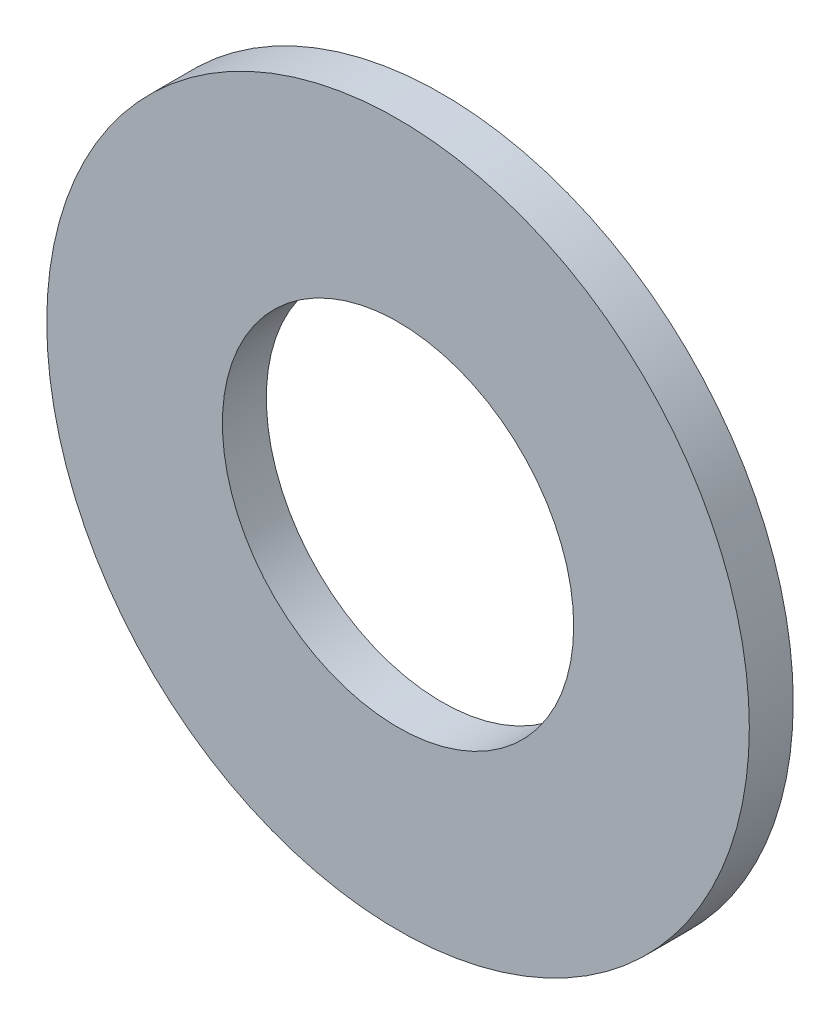
ISO-10303-21;
HEADER;
FILE_DESCRIPTION(('STEP AP214'),'2;1');
FILE_NAME('part.step','',(''),(''),'','','');
FILE_SCHEMA(('AUTOMOTIVE_DESIGN { 1 0 10303 214 1 1 1 1 }'));
ENDSEC;
DATA;
#1=APPLICATION_CONTEXT('core data for automotive mechanical design processes');
#2=APPLICATION_PROTOCOL_DEFINITION('international standard','automotive_design',2000,#1);
#3=PRODUCT_CONTEXT('',#1,'mechanical');
#4=PRODUCT('Part','Part','',(#3));
#5=PRODUCT_RELATED_PRODUCT_CATEGORY('part','',(#4));
#6=PRODUCT_DEFINITION_FORMATION('','',#4);
#7=PRODUCT_DEFINITION_CONTEXT('part definition',#1,'design');
#8=PRODUCT_DEFINITION('design','',#6,#7);
#9=PRODUCT_DEFINITION_SHAPE('','',#8);
#10=(LENGTH_UNIT() NAMED_UNIT(*) SI_UNIT(.MILLI.,.METRE.));
#11=(NAMED_UNIT(*) PLANE_ANGLE_UNIT() SI_UNIT($,.RADIAN.));
#12=(NAMED_UNIT(*) SI_UNIT($,.STERADIAN.) SOLID_ANGLE_UNIT());
#13=UNCERTAINTY_MEASURE_WITH_UNIT(LENGTH_MEASURE(1.E-05),#10,'distance_accuracy_value','');
#14=(GEOMETRIC_REPRESENTATION_CONTEXT(3) GLOBAL_UNCERTAINTY_ASSIGNED_CONTEXT((#13)) GLOBAL_UNIT_ASSIGNED_CONTEXT((#10,
#11,#12)) REPRESENTATION_CONTEXT('',''));
#15=CARTESIAN_POINT('',(0.,0.,0.));
#16=DIRECTION('',(0.,0.,1.));
#17=DIRECTION('',(1.,0.,0.));
#18=AXIS2_PLACEMENT_3D('',#15,#16,#17);
#19=CARTESIAN_POINT('',(-14.2007607568322,-9.72716850063172,0.5));
#20=DIRECTION('',(0.,0.,1.));
#21=DIRECTION('',(1.,0.,0.));
#22=AXIS2_PLACEMENT_3D('',#19,#20,#21);
#23=PLANE('',#22);
#24=CARTESIAN_POINT('',(-14.2007607568322,-9.72716850063172,0.5));
#25=DIRECTION('',(0.,0.,1.));
#26=DIRECTION('',(1.,0.,0.));
#27=AXIS2_PLACEMENT_3D('',#24,#25,#26);
#28=CIRCLE('',#27,4.);
#29=CARTESIAN_POINT('',(-10.2007607568322,-9.72716850063172,0.5));
#30=VERTEX_POINT('',#29);
#31=EDGE_CURVE('E10',#30,#30,#28,.T.);
#32=ORIENTED_EDGE('',*,*,#31,.T.);
#33=EDGE_LOOP('',(#32));
#34=FACE_BOUND('',#33,.T.);
#35=CARTESIAN_POINT('',(-14.2007607568322,-9.72716850063172,0.5));
#36=DIRECTION('',(0.,0.,1.));
#37=DIRECTION('',(1.,0.,0.));
#38=AXIS2_PLACEMENT_3D('',#35,#36,#37);
#39=CIRCLE('',#38,2.);
#40=CARTESIAN_POINT('',(-12.2007607568322,-9.72716850063172,0.5));
#41=VERTEX_POINT('',#40);
#42=EDGE_CURVE('E48',#41,#41,#39,.T.);
#43=ORIENTED_EDGE('',*,*,#42,.F.);
#44=EDGE_LOOP('',(#43));
#45=FACE_BOUND('',#44,.T.);
#46=ADVANCED_FACE('F37',(#34,#45),#23,.T.);
#47=CARTESIAN_POINT('',(-14.2007607568322,-9.72716850063172,0.));
#48=DIRECTION('',(0.,0.,1.));
#49=DIRECTION('',(1.,0.,0.));
#50=AXIS2_PLACEMENT_3D('',#47,#48,#49);
#51=PLANE('',#50);
#52=CARTESIAN_POINT('',(-14.2007607568322,-9.72716850063172,0.));
#53=DIRECTION('',(0.,0.,1.));
#54=DIRECTION('',(1.,0.,0.));
#55=AXIS2_PLACEMENT_3D('',#52,#53,#54);
#56=CIRCLE('',#55,4.);
#57=CARTESIAN_POINT('',(-10.2007607568322,-9.72716850063172,0.));
#58=VERTEX_POINT('',#57);
#59=EDGE_CURVE('E41',#58,#58,#56,.T.);
#60=ORIENTED_EDGE('',*,*,#59,.F.);
#61=EDGE_LOOP('',(#60));
#62=FACE_BOUND('',#61,.T.);
#63=CARTESIAN_POINT('',(-14.2007607568322,-9.72716850063172,0.));
#64=DIRECTION('',(0.,0.,1.));
#65=DIRECTION('',(1.,0.,0.));
#66=AXIS2_PLACEMENT_3D('',#63,#64,#65);
#67=CIRCLE('',#66,2.);
#68=CARTESIAN_POINT('',(-12.2007607568322,-9.72716850063172,0.));
#69=VERTEX_POINT('',#68);
#70=EDGE_CURVE('E50',#69,#69,#67,.T.);
#71=ORIENTED_EDGE('',*,*,#70,.T.);
#72=EDGE_LOOP('',(#71));
#73=FACE_BOUND('',#72,.T.);
#74=ADVANCED_FACE('F60',(#62,#73),#51,.F.);
#75=CARTESIAN_POINT('',(-14.2007607568322,-9.72716850063172,0.5));
#76=DIRECTION('',(0.,0.,-1.));
#77=DIRECTION('',(-1.,0.,0.));
#78=AXIS2_PLACEMENT_3D('',#75,#76,#77);
#79=CYLINDRICAL_SURFACE('',#78,4.);
#80=ORIENTED_EDGE('',*,*,#31,.F.);
#81=EDGE_LOOP('',(#80));
#82=FACE_BOUND('',#81,.T.);
#83=ORIENTED_EDGE('',*,*,#59,.T.);
#84=EDGE_LOOP('',(#83));
#85=FACE_BOUND('',#84,.T.);
#86=ADVANCED_FACE('F39',(#82,#85),#79,.T.);
#87=CARTESIAN_POINT('',(-14.2007607568322,-9.72716850063172,0.5));
#88=DIRECTION('',(0.,0.,-1.));
#89=DIRECTION('',(-1.,0.,0.));
#90=AXIS2_PLACEMENT_3D('',#87,#88,#89);
#91=CYLINDRICAL_SURFACE('',#90,2.);
#92=ORIENTED_EDGE('',*,*,#42,.T.);
#93=EDGE_LOOP('',(#92));
#94=FACE_BOUND('',#93,.T.);
#95=ORIENTED_EDGE('',*,*,#70,.F.);
#96=EDGE_LOOP('',(#95));
#97=FACE_BOUND('',#96,.T.);
#98=ADVANCED_FACE('F56',(#94,#97),#91,.F.);
#99=CLOSED_SHELL('',(#46,#74,#86,#98));
#100=MANIFOLD_SOLID_BREP('B2',#99);
#101=ADVANCED_BREP_SHAPE_REPRESENTATION('',(#18,#100),#14);
#102=SHAPE_DEFINITION_REPRESENTATION(#9,#101);
ENDSEC;
END-ISO-10303-21;
